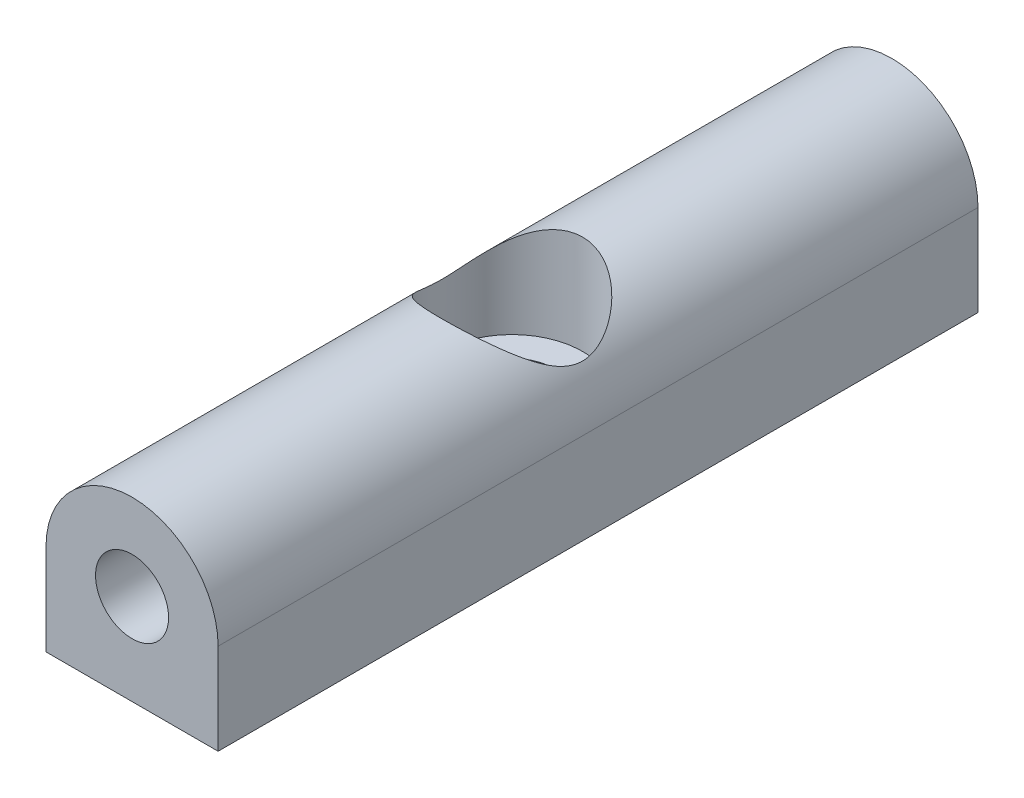
ISO-10303-21;
HEADER;
FILE_DESCRIPTION(('STEP AP214'),'2;1');
FILE_NAME('part.step','',(''),(''),'','','');
FILE_SCHEMA(('AUTOMOTIVE_DESIGN { 1 0 10303 214 1 1 1 1 }'));
ENDSEC;
DATA;
#1=APPLICATION_CONTEXT('core data for automotive mechanical design processes');
#2=APPLICATION_PROTOCOL_DEFINITION('international standard','automotive_design',2000,#1);
#3=PRODUCT_CONTEXT('',#1,'mechanical');
#4=PRODUCT('Part','Part','',(#3));
#5=PRODUCT_RELATED_PRODUCT_CATEGORY('part','',(#4));
#6=PRODUCT_DEFINITION_FORMATION('','',#4);
#7=PRODUCT_DEFINITION_CONTEXT('part definition',#1,'design');
#8=PRODUCT_DEFINITION('design','',#6,#7);
#9=PRODUCT_DEFINITION_SHAPE('','',#8);
#10=(LENGTH_UNIT() NAMED_UNIT(*) SI_UNIT(.MILLI.,.METRE.));
#11=(NAMED_UNIT(*) PLANE_ANGLE_UNIT() SI_UNIT($,.RADIAN.));
#12=(NAMED_UNIT(*) SI_UNIT($,.STERADIAN.) SOLID_ANGLE_UNIT());
#13=UNCERTAINTY_MEASURE_WITH_UNIT(LENGTH_MEASURE(1.E-05),#10,'distance_accuracy_value','');
#14=(GEOMETRIC_REPRESENTATION_CONTEXT(3) GLOBAL_UNCERTAINTY_ASSIGNED_CONTEXT((#13)) GLOBAL_UNIT_ASSIGNED_CONTEXT((#10,
#11,#12)) REPRESENTATION_CONTEXT('',''));
#15=CARTESIAN_POINT('',(0.,0.,0.));
#16=DIRECTION('',(0.,0.,1.));
#17=DIRECTION('',(1.,0.,0.));
#18=AXIS2_PLACEMENT_3D('',#15,#16,#17);
#19=CARTESIAN_POINT('',(0.,-0.524999999999995,15.3423));
#20=DIRECTION('',(0.,1.,0.));
#21=DIRECTION('',(0.,0.,1.));
#22=AXIS2_PLACEMENT_3D('',#19,#20,#21);
#23=CYLINDRICAL_SURFACE('',#22,2.85);
#24=CARTESIAN_POINT('',(0.,-0.524999999999995,15.3423));
#25=DIRECTION('',(0.,1.,0.));
#26=DIRECTION('',(0.,0.,1.));
#27=AXIS2_PLACEMENT_3D('',#24,#25,#26);
#28=CIRCLE('',#27,2.85);
#29=CARTESIAN_POINT('',(0.,-0.524999999999995,18.1923));
#30=VERTEX_POINT('',#29);
#31=EDGE_CURVE('E132',#30,#30,#28,.T.);
#32=ORIENTED_EDGE('',*,*,#31,.F.);
#33=EDGE_LOOP('',(#32));
#34=FACE_BOUND('',#33,.T.);
#35=CARTESIAN_POINT('',(0.,3.475,18.1923));
#36=CARTESIAN_POINT('',(-0.0679708240341435,3.47499978547716,18.1922997758882));
#37=CARTESIAN_POINT('',(-0.135944554908596,3.47299990504283,18.1898625662348));
#38=CARTESIAN_POINT('',(-0.271325307152499,3.4650568308574,18.1801689274358));
#39=CARTESIAN_POINT('',(-0.338732062819683,3.45911188237576,18.1729103537897));
#40=CARTESIAN_POINT('',(-0.539436331244801,3.43550880785382,18.1440370020271));
#41=CARTESIAN_POINT('',(-0.671133431665764,3.41208267781289,18.1153248008293));
#42=CARTESIAN_POINT('',(-0.92539414474552,3.35205803092829,18.041121286532));
#43=CARTESIAN_POINT('',(-1.04801007064671,3.31554342869262,17.9957368198824));
#44=CARTESIAN_POINT('',(-1.2828771668209,3.23193430626747,17.8904941443118));
#45=CARTESIAN_POINT('',(-1.3951273656434,3.18483879587822,17.8306345807187));
#46=CARTESIAN_POINT('',(-1.64653003438625,3.06437144699303,17.6747921006398));
#47=CARTESIAN_POINT('',(-1.78081302151862,2.98764465384012,17.5735634407657));
#48=CARTESIAN_POINT('',(-2.02751455609266,2.82605822667453,17.3521026608948));
#49=CARTESIAN_POINT('',(-2.1398687665361,2.74117572033626,17.2318164442244));
#50=CARTESIAN_POINT('',(-2.29239943943807,2.61248499543988,17.0376815206911));
#51=CARTESIAN_POINT('',(-2.34092923805423,2.56897227675333,16.9700297272006));
#52=CARTESIAN_POINT('',(-2.43213933911377,2.48279141091242,16.8303071618698));
#53=CARTESIAN_POINT('',(-2.47481770739548,2.44012354698888,16.7582349402173));
#54=CARTESIAN_POINT('',(-2.55401773646332,2.35709586672524,16.6097983315291));
#55=CARTESIAN_POINT('',(-2.59055484383327,2.31673043368996,16.5334453773858));
#56=CARTESIAN_POINT('',(-2.65723737522312,2.23993247267718,16.3761662706435));
#57=CARTESIAN_POINT('',(-2.68738830040108,2.2034965731285,16.29524413076));
#58=CARTESIAN_POINT('',(-2.74385456015101,2.13287576870691,16.1190095023953));
#59=CARTESIAN_POINT('',(-2.76932576848911,2.09943582602491,16.0231140105983));
#60=CARTESIAN_POINT('',(-2.81042436463737,2.04409990573756,15.8261269801339));
#61=CARTESIAN_POINT('',(-2.82607627337522,2.02217519458905,15.7250490721583));
#62=CARTESIAN_POINT('',(-2.84645968502667,1.99339905348157,15.5184213504614));
#63=CARTESIAN_POINT('',(-2.85107247544308,1.98671151744776,15.4128352449587));
#64=CARTESIAN_POINT('',(-2.84850168034898,1.99039225750719,15.2020908445173));
#65=CARTESIAN_POINT('',(-2.84131306143855,2.00076781115437,15.0969327513078));
#66=CARTESIAN_POINT('',(-2.81444136406839,2.03840804159008,14.8787284990136));
#67=CARTESIAN_POINT('',(-2.79340609968255,2.06749165288664,14.7661816588471));
#68=CARTESIAN_POINT('',(-2.73942424254176,2.13849077939061,14.5480939839594));
#69=CARTESIAN_POINT('',(-2.70643991684889,2.18044687857015,14.4425766107997));
#70=CARTESIAN_POINT('',(-2.63859568854924,2.26176720623865,14.2618243782631));
#71=CARTESIAN_POINT('',(-2.60580334174041,2.29961421306412,14.1850929419638));
#72=CARTESIAN_POINT('',(-2.5343175345158,2.3781691717883,14.0359410698387));
#73=CARTESIAN_POINT('',(-2.49562091170127,2.41887865052232,13.9635229733618));
#74=CARTESIAN_POINT('',(-2.37096624209836,2.54319909467954,13.7523958904339));
#75=CARTESIAN_POINT('',(-2.27647185362042,2.62896569614496,13.61988827111));
#76=CARTESIAN_POINT('',(-2.06120210992307,2.80123894801276,13.3667897197795));
#77=CARTESIAN_POINT('',(-1.93951774021796,2.88763501505992,13.2468983091202));
#78=CARTESIAN_POINT('',(-1.67257165555879,3.04998325452816,13.028301404839));
#79=CARTESIAN_POINT('',(-1.52736836492557,3.12596046663809,12.9295447855167));
#80=CARTESIAN_POINT('',(-1.25685176245777,3.24213770560079,12.7810831510365));
#81=CARTESIAN_POINT('',(-1.13663628182177,3.28646909361479,12.7253253521154));
#82=CARTESIAN_POINT('',(-0.886108795475555,3.36266637045224,12.6302501207545));
#83=CARTESIAN_POINT('',(-0.755803975954636,3.39454103555394,12.5909211121993));
#84=CARTESIAN_POINT('',(-0.487266872611267,3.44338813882315,12.5308760494182));
#85=CARTESIAN_POINT('',(-0.348988389533638,3.46026193278803,12.5102831817162));
#86=CARTESIAN_POINT('',(-0.0698893192741503,3.47710366915649,12.4897287513021));
#87=CARTESIAN_POINT('',(0.0709301507182324,3.47707886854251,12.4897583324248));
#88=CARTESIAN_POINT('',(0.335530270428844,3.46103961582328,12.5093346704031));
#89=CARTESIAN_POINT('',(0.459570760673494,3.44667396813616,12.5268688825714));
#90=CARTESIAN_POINT('',(0.702288081112195,3.40552159498712,12.5774010165425));
#91=CARTESIAN_POINT('',(0.820963942486536,3.37873263570727,12.6104017193644));
#92=CARTESIAN_POINT('',(1.0545168059181,3.31343368635604,12.6915789410953));
#93=CARTESIAN_POINT('',(1.16911452057127,3.27454550530536,12.7402471956968));
#94=CARTESIAN_POINT('',(1.38828690694862,3.18782232397975,12.8502682000814));
#95=CARTESIAN_POINT('',(1.49285862922468,3.13998470309722,12.9116246658288));
#96=CARTESIAN_POINT('',(1.7361621599021,3.01456090258548,13.075491836677));
#97=CARTESIAN_POINT('',(1.86897324229892,2.93330104594567,13.184069677361));
#98=CARTESIAN_POINT('',(2.05067139535605,2.80640321571507,13.3612751544242));
#99=CARTESIAN_POINT('',(2.10843652195846,2.76315808528098,13.4229006993039));
#100=CARTESIAN_POINT('',(2.21806454476964,2.67594924352865,13.5507171494587));
#101=CARTESIAN_POINT('',(2.26992990672563,2.63198584125596,13.6169061287777));
#102=CARTESIAN_POINT('',(2.36854477142196,2.5436352812186,13.7549072946837));
#103=CARTESIAN_POINT('',(2.4151915549502,2.49925374387253,13.8267963189279));
#104=CARTESIAN_POINT('',(2.50222791925934,2.41210917504049,13.9752725505792));
#105=CARTESIAN_POINT('',(2.54261456229202,2.36934691051473,14.0518619403738));
#106=CARTESIAN_POINT('',(2.61665667949223,2.2873064295857,14.2095334867838));
#107=CARTESIAN_POINT('',(2.65034116718512,2.24801362437313,14.2905942479057));
#108=CARTESIAN_POINT('',(2.71065560895622,2.17490549994459,14.4575880319544));
#109=CARTESIAN_POINT('',(2.73729459002858,2.14108319350723,14.5435146473861));
#110=CARTESIAN_POINT('',(2.78372166755246,2.08039551321632,14.7239076565091));
#111=CARTESIAN_POINT('',(2.80318137327895,2.05387516327169,14.8185801806817));
#112=CARTESIAN_POINT('',(2.83246121118134,2.01331459694735,15.011892861034));
#113=CARTESIAN_POINT('',(2.84230585018803,1.99924266080062,15.1105222596712));
#114=CARTESIAN_POINT('',(2.85157197054135,1.98601210757924,15.3099650745772));
#115=CARTESIAN_POINT('',(2.850926929385,1.98694866949161,15.4107883769394));
#116=CARTESIAN_POINT('',(2.83911423646124,2.00378202469643,15.6106077567881));
#117=CARTESIAN_POINT('',(2.82793044882193,2.01970175867379,15.7096007949308));
#118=CARTESIAN_POINT('',(2.79175261371221,2.06951607141097,15.9288607474734));
#119=CARTESIAN_POINT('',(2.76387742756878,2.10706424776898,16.0477864333282));
#120=CARTESIAN_POINT('',(2.69500881353363,2.19445418892972,16.2771066851583));
#121=CARTESIAN_POINT('',(2.65397432149298,2.24433432299247,16.3874731849589));
#122=CARTESIAN_POINT('',(2.57145695053937,2.33798381093412,16.5743273800408));
#123=CARTESIAN_POINT('',(2.53241099641844,2.38037695581212,16.6526211617059));
#124=CARTESIAN_POINT('',(2.44786917216256,2.46723167627917,16.8044884324288));
#125=CARTESIAN_POINT('',(2.40237025117711,2.511694223527,16.8780596647105));
#126=CARTESIAN_POINT('',(2.3050564843634,2.6012925301232,17.0205928447602));
#127=CARTESIAN_POINT('',(2.25323512528254,2.64642894095225,17.0895499239652));
#128=CARTESIAN_POINT('',(2.14337567391533,2.73616462370429,17.22269579765));
#129=CARTESIAN_POINT('',(2.08533789507087,2.7807639225833,17.2868848322662));
#130=CARTESIAN_POINT('',(1.96182286485487,2.8692796279051,17.4115030070723));
#131=CARTESIAN_POINT('',(1.89621870228991,2.91316388743271,17.4718296116446));
#132=CARTESIAN_POINT('',(1.75858510979268,2.99825803087437,17.5868313270099));
#133=CARTESIAN_POINT('',(1.6865545258276,3.03946743214273,17.6415054189247));
#134=CARTESIAN_POINT('',(1.53638672474873,3.11806046151823,17.7444401090251));
#135=CARTESIAN_POINT('',(1.45826529286605,3.15545343480862,17.7927164642171));
#136=CARTESIAN_POINT('',(1.29611813164226,3.22544555748241,17.8822113758974));
#137=CARTESIAN_POINT('',(1.21209606655351,3.25804764374292,17.9234342588269));
#138=CARTESIAN_POINT('',(1.00891507573343,3.32758676044753,18.0107507292513));
#139=CARTESIAN_POINT('',(0.887561586306231,3.36219734790919,18.0536940571647));
#140=CARTESIAN_POINT('',(0.637529803801006,3.41840709629676,18.1230909913222));
#141=CARTESIAN_POINT('',(0.508870115162012,3.44003781433905,18.1495845962066));
#142=CARTESIAN_POINT('',(0.315881729444394,3.46118761991161,18.1754454247299));
#143=CARTESIAN_POINT('',(0.25300506943114,3.4663551188187,18.1817537222559));
#144=CARTESIAN_POINT('',(0.126753197839406,3.47326184859519,18.1901816516242));
#145=CARTESIAN_POINT('',(0.063377862553651,3.47500020002699,18.192300208968));
#146=CARTESIAN_POINT('',(0.,3.475,18.1923));
#147=B_SPLINE_CURVE_WITH_KNOTS('',3,(#35,#36,#37,#38,#39,#40,#41,#42,#43,#44,#45,#46,#47,#48,
#49,#50,#51,#52,#53,#54,#55,#56,#57,#58,#59,#60,#61,#62,#63,#64,#65,#66,#67,#68,#69,#70,#71,#72,
#73,#74,#75,#76,#77,#78,#79,#80,#81,#82,#83,#84,#85,#86,#87,#88,#89,#90,#91,#92,#93,#94,#95,#96,
#97,#98,#99,#100,#101,#102,#103,#104,#105,#106,#107,#108,#109,#110,#111,#112,#113,#114,#115,
#116,#117,#118,#119,#120,#121,#122,#123,#124,#125,#126,#127,#128,#129,#130,#131,#132,#133,#134,
#135,#136,#137,#138,#139,#140,#141,#142,#143,#144,#145,#146),.UNSPECIFIED.,.T.,.F.,(4,2,2,2,2,2,
2,2,2,2,2,2,2,2,2,2,2,2,2,2,2,2,2,2,2,2,2,2,2,2,2,2,2,2,2,2,2,2,2,2,2,2,2,2,2,2,2,2,2,2,2,2,2,2,
2,4),(0.,0.203837548140002,0.407765822200556,0.81587183484528,1.22140681633565,1.62697976508079,
2.17860916923796,2.73183344563632,3.01343224841818,3.29512390904785,3.57609609406165,
3.85682525190122,4.16994988833814,4.48228943889271,4.79797302529971,5.11379128838341,
5.46623159672748,5.81979468910627,6.09432104904925,6.36899496803792,6.91860192128751,
7.49045703272788,8.06091276895192,8.47849361096348,8.89577971725317,9.31578997983764,
9.73561987208648,10.112165099587,10.4887780594152,10.8786019851489,11.2685402397258,
11.8347090352141,12.119178721926,12.4035290771473,12.6927447976467,12.9820958325724,
13.2701656311963,13.5578645350171,13.8574457642205,14.1562614141026,14.4569728008971,
14.7581453561976,15.1393888084201,15.521833715951,15.8131448119873,16.1045940968241,
16.3963462032641,16.6880836060127,16.9857321881437,17.2834343288987,17.5803890632134,
17.8771609940897,18.2753582484894,18.6725834274026,18.8625984290752,19.0526621555764),.UNSPECIFIED.);
#148=CARTESIAN_POINT('',(0.,3.475,18.1923));
#149=VERTEX_POINT('',#148);
#150=EDGE_CURVE('E217',#149,#149,#147,.T.);
#151=ORIENTED_EDGE('',*,*,#150,.F.);
#152=EDGE_LOOP('',(#151));
#153=FACE_BOUND('',#152,.T.);
#154=ADVANCED_FACE('F79',(#34,#153),#23,.F.);
#155=CARTESIAN_POINT('',(0.,0.,30.6846));
#156=DIRECTION('',(0.,0.,-1.));
#157=DIRECTION('',(-1.,0.,0.));
#158=AXIS2_PLACEMENT_3D('',#155,#156,#157);
#159=CYLINDRICAL_SURFACE('',#158,3.475);
#160=CARTESIAN_POINT('',(0.,0.,0.));
#161=DIRECTION('',(0.,0.,1.));
#162=DIRECTION('',(1.,0.,0.));
#163=AXIS2_PLACEMENT_3D('',#160,#161,#162);
#164=CIRCLE('',#163,3.475);
#165=CARTESIAN_POINT('',(3.475,0.,0.));
#166=VERTEX_POINT('',#165);
#167=CARTESIAN_POINT('',(-3.475,0.,0.));
#168=VERTEX_POINT('',#167);
#169=EDGE_CURVE('E83',#166,#168,#164,.T.);
#170=ORIENTED_EDGE('',*,*,#169,.T.);
#171=DIRECTION('',(0.,0.,-1.));
#172=VECTOR('',#171,1.);
#173=CARTESIAN_POINT('',(-3.475,0.,35.5989921292465));
#174=LINE('',#173,#172);
#175=CARTESIAN_POINT('',(-3.475,0.,30.6846));
#176=VERTEX_POINT('',#175);
#177=EDGE_CURVE('E137',#176,#168,#174,.T.);
#178=ORIENTED_EDGE('',*,*,#177,.F.);
#179=CARTESIAN_POINT('',(0.,0.,30.6846));
#180=DIRECTION('',(0.,0.,1.));
#181=DIRECTION('',(1.,0.,0.));
#182=AXIS2_PLACEMENT_3D('',#179,#180,#181);
#183=CIRCLE('',#182,3.475);
#184=CARTESIAN_POINT('',(3.475,0.,30.6846));
#185=VERTEX_POINT('',#184);
#186=EDGE_CURVE('E14',#185,#176,#183,.T.);
#187=ORIENTED_EDGE('',*,*,#186,.F.);
#188=DIRECTION('',(0.,0.,-1.));
#189=VECTOR('',#188,1.);
#190=CARTESIAN_POINT('',(3.475,0.,35.5989921292465));
#191=LINE('',#190,#189);
#192=EDGE_CURVE('E98',#185,#166,#191,.T.);
#193=ORIENTED_EDGE('',*,*,#192,.T.);
#194=EDGE_LOOP('',(#170,#178,#187,#193));
#195=FACE_BOUND('',#194,.T.);
#196=ORIENTED_EDGE('',*,*,#150,.T.);
#197=EDGE_LOOP('',(#196));
#198=FACE_BOUND('',#197,.T.);
#199=ADVANCED_FACE('F81',(#195,#198),#159,.T.);
#200=CARTESIAN_POINT('',(0.,0.,30.6846));
#201=DIRECTION('',(0.,0.,1.));
#202=DIRECTION('',(1.,0.,0.));
#203=AXIS2_PLACEMENT_3D('',#200,#201,#202);
#204=PLANE('',#203);
#205=CARTESIAN_POINT('',(0.,0.,30.6846));
#206=DIRECTION('',(0.,0.,1.));
#207=DIRECTION('',(1.,0.,0.));
#208=AXIS2_PLACEMENT_3D('',#205,#206,#207);
#209=CIRCLE('',#208,1.475);
#210=CARTESIAN_POINT('',(1.475,0.,30.6846));
#211=VERTEX_POINT('',#210);
#212=EDGE_CURVE('E172',#211,#211,#209,.T.);
#213=ORIENTED_EDGE('',*,*,#212,.F.);
#214=EDGE_LOOP('',(#213));
#215=FACE_BOUND('',#214,.T.);
#216=ORIENTED_EDGE('',*,*,#186,.T.);
#217=DIRECTION('',(0.,-1.,0.));
#218=VECTOR('',#217,1.);
#219=CARTESIAN_POINT('',(-3.475,0.,30.6846));
#220=LINE('',#219,#218);
#221=CARTESIAN_POINT('',(-3.475,-3.675,30.6846));
#222=VERTEX_POINT('',#221);
#223=EDGE_CURVE('E140',#176,#222,#220,.T.);
#224=ORIENTED_EDGE('',*,*,#223,.T.);
#225=DIRECTION('',(-1.,0.,0.));
#226=VECTOR('',#225,1.);
#227=CARTESIAN_POINT('',(-3.475,-3.675,30.6846));
#228=LINE('',#227,#226);
#229=CARTESIAN_POINT('',(3.475,-3.675,30.6846));
#230=VERTEX_POINT('',#229);
#231=EDGE_CURVE('E129',#230,#222,#228,.T.);
#232=ORIENTED_EDGE('',*,*,#231,.F.);
#233=DIRECTION('',(0.,-1.,0.));
#234=VECTOR('',#233,1.);
#235=CARTESIAN_POINT('',(3.475,0.,30.6846));
#236=LINE('',#235,#234);
#237=EDGE_CURVE('E162',#185,#230,#236,.T.);
#238=ORIENTED_EDGE('',*,*,#237,.F.);
#239=EDGE_LOOP('',(#216,#224,#232,#238));
#240=FACE_BOUND('',#239,.T.);
#241=ADVANCED_FACE('F186',(#215,#240),#204,.T.);
#242=CARTESIAN_POINT('',(0.,0.,0.));
#243=DIRECTION('',(0.,0.,1.));
#244=DIRECTION('',(1.,0.,0.));
#245=AXIS2_PLACEMENT_3D('',#242,#243,#244);
#246=PLANE('',#245);
#247=CARTESIAN_POINT('',(0.,0.,0.));
#248=DIRECTION('',(0.,0.,-1.));
#249=DIRECTION('',(-1.,0.,0.));
#250=AXIS2_PLACEMENT_3D('',#247,#248,#249);
#251=CIRCLE('',#250,1.475);
#252=CARTESIAN_POINT('',(-1.475,0.,0.));
#253=VERTEX_POINT('',#252);
#254=EDGE_CURVE('E166',#253,#253,#251,.T.);
#255=ORIENTED_EDGE('',*,*,#254,.F.);
#256=EDGE_LOOP('',(#255));
#257=FACE_BOUND('',#256,.T.);
#258=ORIENTED_EDGE('',*,*,#169,.F.);
#259=DIRECTION('',(0.,-1.,0.));
#260=VECTOR('',#259,1.);
#261=CARTESIAN_POINT('',(3.475,0.,0.));
#262=LINE('',#261,#260);
#263=CARTESIAN_POINT('',(3.475,-3.675,0.));
#264=VERTEX_POINT('',#263);
#265=EDGE_CURVE('E144',#166,#264,#262,.T.);
#266=ORIENTED_EDGE('',*,*,#265,.T.);
#267=DIRECTION('',(1.,0.,0.));
#268=VECTOR('',#267,1.);
#269=CARTESIAN_POINT('',(-3.475,-3.675,0.));
#270=LINE('',#269,#268);
#271=CARTESIAN_POINT('',(-3.475,-3.675,0.));
#272=VERTEX_POINT('',#271);
#273=EDGE_CURVE('E126',#272,#264,#270,.T.);
#274=ORIENTED_EDGE('',*,*,#273,.F.);
#275=DIRECTION('',(0.,-1.,0.));
#276=VECTOR('',#275,1.);
#277=CARTESIAN_POINT('',(-3.475,0.,0.));
#278=LINE('',#277,#276);
#279=EDGE_CURVE('E135',#168,#272,#278,.T.);
#280=ORIENTED_EDGE('',*,*,#279,.F.);
#281=EDGE_LOOP('',(#258,#266,#274,#280));
#282=FACE_BOUND('',#281,.T.);
#283=ADVANCED_FACE('F142',(#257,#282),#246,.F.);
#284=CARTESIAN_POINT('',(0.,0.,20.6846));
#285=DIRECTION('',(0.,0.,1.));
#286=DIRECTION('',(1.,0.,0.));
#287=AXIS2_PLACEMENT_3D('',#284,#285,#286);
#288=CYLINDRICAL_SURFACE('',#287,1.475);
#289=CARTESIAN_POINT('',(0.,0.,20.6846));
#290=DIRECTION('',(0.,0.,1.));
#291=DIRECTION('',(1.,0.,0.));
#292=AXIS2_PLACEMENT_3D('',#289,#290,#291);
#293=CIRCLE('',#292,1.475);
#294=CARTESIAN_POINT('',(1.475,0.,20.6846));
#295=VERTEX_POINT('',#294);
#296=EDGE_CURVE('E176',#295,#295,#293,.T.);
#297=ORIENTED_EDGE('',*,*,#296,.F.);
#298=EDGE_LOOP('',(#297));
#299=FACE_BOUND('',#298,.T.);
#300=ORIENTED_EDGE('',*,*,#212,.T.);
#301=EDGE_LOOP('',(#300));
#302=FACE_BOUND('',#301,.T.);
#303=ADVANCED_FACE('F184',(#299,#302),#288,.F.);
#304=CARTESIAN_POINT('',(0.,0.,20.6846));
#305=DIRECTION('',(0.,0.,1.));
#306=DIRECTION('',(1.,0.,0.));
#307=AXIS2_PLACEMENT_3D('',#304,#305,#306);
#308=PLANE('',#307);
#309=ORIENTED_EDGE('',*,*,#296,.T.);
#310=EDGE_LOOP('',(#309));
#311=FACE_BOUND('',#310,.T.);
#312=ADVANCED_FACE('F353',(#311),#308,.T.);
#313=CARTESIAN_POINT('',(0.,0.,10.));
#314=DIRECTION('',(0.,0.,-1.));
#315=DIRECTION('',(-1.,0.,0.));
#316=AXIS2_PLACEMENT_3D('',#313,#314,#315);
#317=CYLINDRICAL_SURFACE('',#316,1.475);
#318=CARTESIAN_POINT('',(0.,0.,10.));
#319=DIRECTION('',(0.,0.,-1.));
#320=DIRECTION('',(-1.,0.,0.));
#321=AXIS2_PLACEMENT_3D('',#318,#319,#320);
#322=CIRCLE('',#321,1.475);
#323=CARTESIAN_POINT('',(-1.475,0.,10.));
#324=VERTEX_POINT('',#323);
#325=EDGE_CURVE('E168',#324,#324,#322,.T.);
#326=ORIENTED_EDGE('',*,*,#325,.F.);
#327=EDGE_LOOP('',(#326));
#328=FACE_BOUND('',#327,.T.);
#329=ORIENTED_EDGE('',*,*,#254,.T.);
#330=EDGE_LOOP('',(#329));
#331=FACE_BOUND('',#330,.T.);
#332=ADVANCED_FACE('F200',(#328,#331),#317,.F.);
#333=CARTESIAN_POINT('',(0.,0.,10.));
#334=DIRECTION('',(0.,0.,-1.));
#335=DIRECTION('',(-1.,0.,0.));
#336=AXIS2_PLACEMENT_3D('',#333,#334,#335);
#337=PLANE('',#336);
#338=ORIENTED_EDGE('',*,*,#325,.T.);
#339=EDGE_LOOP('',(#338));
#340=FACE_BOUND('',#339,.T.);
#341=ADVANCED_FACE('F193',(#340),#337,.T.);
#342=CARTESIAN_POINT('',(3.475,0.,35.5989921292465));
#343=DIRECTION('',(1.,0.,0.));
#344=DIRECTION('',(0.,0.,-1.));
#345=AXIS2_PLACEMENT_3D('',#342,#343,#344);
#346=PLANE('',#345);
#347=ORIENTED_EDGE('',*,*,#237,.T.);
#348=DIRECTION('',(0.,0.,1.));
#349=VECTOR('',#348,1.);
#350=CARTESIAN_POINT('',(3.475,-3.675,30.6846));
#351=LINE('',#350,#349);
#352=EDGE_CURVE('E146',#264,#230,#351,.T.);
#353=ORIENTED_EDGE('',*,*,#352,.F.);
#354=ORIENTED_EDGE('',*,*,#265,.F.);
#355=ORIENTED_EDGE('',*,*,#192,.F.);
#356=EDGE_LOOP('',(#347,#353,#354,#355));
#357=FACE_BOUND('',#356,.T.);
#358=ADVANCED_FACE('F191',(#357),#346,.T.);
#359=CARTESIAN_POINT('',(-3.475,0.,35.5989921292465));
#360=DIRECTION('',(1.,0.,0.));
#361=DIRECTION('',(0.,0.,-1.));
#362=AXIS2_PLACEMENT_3D('',#359,#360,#361);
#363=PLANE('',#362);
#364=ORIENTED_EDGE('',*,*,#177,.T.);
#365=ORIENTED_EDGE('',*,*,#279,.T.);
#366=DIRECTION('',(0.,0.,-1.));
#367=VECTOR('',#366,1.);
#368=CARTESIAN_POINT('',(-3.475,-3.675,30.6846));
#369=LINE('',#368,#367);
#370=EDGE_CURVE('E121',#222,#272,#369,.T.);
#371=ORIENTED_EDGE('',*,*,#370,.F.);
#372=ORIENTED_EDGE('',*,*,#223,.F.);
#373=EDGE_LOOP('',(#364,#365,#371,#372));
#374=FACE_BOUND('',#373,.T.);
#375=ADVANCED_FACE('F136',(#374),#363,.F.);
#376=CARTESIAN_POINT('',(0.,-3.675,0.));
#377=DIRECTION('',(0.,-1.,0.));
#378=DIRECTION('',(0.,0.,-1.));
#379=AXIS2_PLACEMENT_3D('',#376,#377,#378);
#380=PLANE('',#379);
#381=ORIENTED_EDGE('',*,*,#352,.T.);
#382=ORIENTED_EDGE('',*,*,#231,.T.);
#383=ORIENTED_EDGE('',*,*,#370,.T.);
#384=ORIENTED_EDGE('',*,*,#273,.T.);
#385=EDGE_LOOP('',(#381,#382,#383,#384));
#386=FACE_BOUND('',#385,.T.);
#387=CARTESIAN_POINT('',(0.,-3.675,15.3423));
#388=DIRECTION('',(0.,1.,0.));
#389=DIRECTION('',(0.,0.,1.));
#390=AXIS2_PLACEMENT_3D('',#387,#388,#389);
#391=CIRCLE('',#390,1.675);
#392=CARTESIAN_POINT('',(0.,-3.675,17.0173));
#393=VERTEX_POINT('',#392);
#394=EDGE_CURVE('E226',#393,#393,#391,.T.);
#395=ORIENTED_EDGE('',*,*,#394,.T.);
#396=EDGE_LOOP('',(#395));
#397=FACE_BOUND('',#396,.T.);
#398=ADVANCED_FACE('F123',(#386,#397),#380,.T.);
#399=CARTESIAN_POINT('',(0.,-0.524999999999995,0.));
#400=DIRECTION('',(0.,1.,0.));
#401=DIRECTION('',(0.,0.,1.));
#402=AXIS2_PLACEMENT_3D('',#399,#400,#401);
#403=PLANE('',#402);
#404=CARTESIAN_POINT('',(0.,-0.524999999999995,15.3423));
#405=DIRECTION('',(0.,1.,0.));
#406=DIRECTION('',(0.,0.,1.));
#407=AXIS2_PLACEMENT_3D('',#404,#405,#406);
#408=CIRCLE('',#407,1.675);
#409=CARTESIAN_POINT('',(0.,-0.524999999999995,17.0173));
#410=VERTEX_POINT('',#409);
#411=EDGE_CURVE('E225',#410,#410,#408,.T.);
#412=ORIENTED_EDGE('',*,*,#411,.F.);
#413=EDGE_LOOP('',(#412));
#414=FACE_BOUND('',#413,.T.);
#415=ORIENTED_EDGE('',*,*,#31,.T.);
#416=EDGE_LOOP('',(#415));
#417=FACE_BOUND('',#416,.T.);
#418=ADVANCED_FACE('F214',(#414,#417),#403,.T.);
#419=CARTESIAN_POINT('',(0.,-3.675,15.3423));
#420=DIRECTION('',(0.,1.,0.));
#421=DIRECTION('',(0.,0.,1.));
#422=AXIS2_PLACEMENT_3D('',#419,#420,#421);
#423=CYLINDRICAL_SURFACE('',#422,1.675);
#424=ORIENTED_EDGE('',*,*,#394,.F.);
#425=EDGE_LOOP('',(#424));
#426=FACE_BOUND('',#425,.T.);
#427=ORIENTED_EDGE('',*,*,#411,.T.);
#428=EDGE_LOOP('',(#427));
#429=FACE_BOUND('',#428,.T.);
#430=ADVANCED_FACE('F229',(#426,#429),#423,.F.);
#431=CLOSED_SHELL('',(#154,#199,#241,#283,#303,#312,#332,#341,#358,#375,#398,#418,#430));
#432=MANIFOLD_SOLID_BREP('B2',#431);
#433=ADVANCED_BREP_SHAPE_REPRESENTATION('',(#18,#432),#14);
#434=SHAPE_DEFINITION_REPRESENTATION(#9,#433);
ENDSEC;
END-ISO-10303-21;
